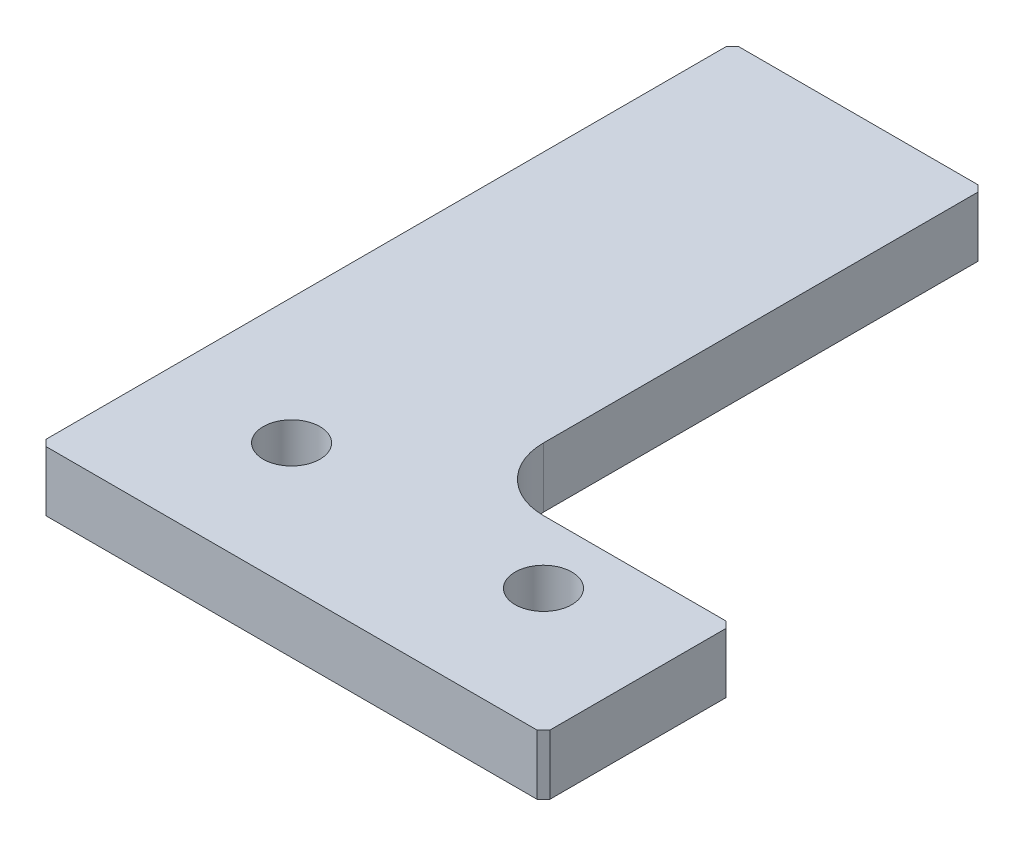
ISO-10303-21;
HEADER;
FILE_DESCRIPTION(('STEP AP214'),'2;1');
FILE_NAME('part.step','',(''),(''),'','','');
FILE_SCHEMA(('AUTOMOTIVE_DESIGN { 1 0 10303 214 1 1 1 1 }'));
ENDSEC;
DATA;
#1=APPLICATION_CONTEXT('core data for automotive mechanical design processes');
#2=APPLICATION_PROTOCOL_DEFINITION('international standard','automotive_design',2000,#1);
#3=PRODUCT_CONTEXT('',#1,'mechanical');
#4=PRODUCT('Part','Part','',(#3));
#5=PRODUCT_RELATED_PRODUCT_CATEGORY('part','',(#4));
#6=PRODUCT_DEFINITION_FORMATION('','',#4);
#7=PRODUCT_DEFINITION_CONTEXT('part definition',#1,'design');
#8=PRODUCT_DEFINITION('design','',#6,#7);
#9=PRODUCT_DEFINITION_SHAPE('','',#8);
#10=(LENGTH_UNIT() NAMED_UNIT(*) SI_UNIT(.MILLI.,.METRE.));
#11=(NAMED_UNIT(*) PLANE_ANGLE_UNIT() SI_UNIT($,.RADIAN.));
#12=(NAMED_UNIT(*) SI_UNIT($,.STERADIAN.) SOLID_ANGLE_UNIT());
#13=UNCERTAINTY_MEASURE_WITH_UNIT(LENGTH_MEASURE(1.E-05),#10,'distance_accuracy_value','');
#14=(GEOMETRIC_REPRESENTATION_CONTEXT(3) GLOBAL_UNCERTAINTY_ASSIGNED_CONTEXT((#13)) GLOBAL_UNIT_ASSIGNED_CONTEXT((#10,
#11,#12)) REPRESENTATION_CONTEXT('',''));
#15=CARTESIAN_POINT('',(0.,0.,0.));
#16=DIRECTION('',(0.,0.,1.));
#17=DIRECTION('',(1.,0.,0.));
#18=AXIS2_PLACEMENT_3D('',#15,#16,#17);
#19=CARTESIAN_POINT('',(20.,9.525,-90.));
#20=DIRECTION('',(0.,0.,1.));
#21=DIRECTION('',(1.,0.,0.));
#22=AXIS2_PLACEMENT_3D('',#19,#20,#21);
#23=PLANE('',#22);
#24=DIRECTION('',(-1.,0.,0.));
#25=VECTOR('',#24,1.);
#26=CARTESIAN_POINT('',(20.,9.525,-90.));
#27=LINE('',#26,#25);
#28=CARTESIAN_POINT('',(19.,9.525,-90.));
#29=VERTEX_POINT('',#28);
#30=CARTESIAN_POINT('',(-19.,9.525,-90.));
#31=VERTEX_POINT('',#30);
#32=EDGE_CURVE('E157',#29,#31,#27,.T.);
#33=ORIENTED_EDGE('',*,*,#32,.F.);
#34=DIRECTION('',(0.,-1.,0.));
#35=VECTOR('',#34,1.);
#36=CARTESIAN_POINT('',(19.,9.525,-90.));
#37=LINE('',#36,#35);
#38=CARTESIAN_POINT('',(19.,0.,-90.));
#39=VERTEX_POINT('',#38);
#40=EDGE_CURVE('E51',#29,#39,#37,.T.);
#41=ORIENTED_EDGE('',*,*,#40,.T.);
#42=DIRECTION('',(-1.,0.,0.));
#43=VECTOR('',#42,1.);
#44=CARTESIAN_POINT('',(20.,0.,-90.));
#45=LINE('',#44,#43);
#46=CARTESIAN_POINT('',(-19.,0.,-90.));
#47=VERTEX_POINT('',#46);
#48=EDGE_CURVE('E234',#39,#47,#45,.T.);
#49=ORIENTED_EDGE('',*,*,#48,.T.);
#50=DIRECTION('',(0.,1.,0.));
#51=VECTOR('',#50,1.);
#52=CARTESIAN_POINT('',(-19.,9.525,-90.));
#53=LINE('',#52,#51);
#54=EDGE_CURVE('E226',#47,#31,#53,.T.);
#55=ORIENTED_EDGE('',*,*,#54,.T.);
#56=EDGE_LOOP('',(#33,#41,#49,#55));
#57=FACE_BOUND('',#56,.T.);
#58=ADVANCED_FACE('F41',(#57),#23,.F.);
#59=CARTESIAN_POINT('',(-20.,9.525,-90.));
#60=DIRECTION('',(1.,0.,0.));
#61=DIRECTION('',(0.,0.,-1.));
#62=AXIS2_PLACEMENT_3D('',#59,#60,#61);
#63=PLANE('',#62);
#64=DIRECTION('',(0.,0.,1.));
#65=VECTOR('',#64,1.);
#66=CARTESIAN_POINT('',(-20.,0.,-90.));
#67=LINE('',#66,#65);
#68=CARTESIAN_POINT('',(-20.,0.,-89.));
#69=VERTEX_POINT('',#68);
#70=CARTESIAN_POINT('',(-20.,0.,19.));
#71=VERTEX_POINT('',#70);
#72=EDGE_CURVE('E240',#69,#71,#67,.T.);
#73=ORIENTED_EDGE('',*,*,#72,.T.);
#74=DIRECTION('',(0.,1.,0.));
#75=VECTOR('',#74,1.);
#76=CARTESIAN_POINT('',(-20.,9.525,19.));
#77=LINE('',#76,#75);
#78=CARTESIAN_POINT('',(-20.,9.525,19.));
#79=VERTEX_POINT('',#78);
#80=EDGE_CURVE('E223',#71,#79,#77,.T.);
#81=ORIENTED_EDGE('',*,*,#80,.T.);
#82=DIRECTION('',(0.,0.,1.));
#83=VECTOR('',#82,1.);
#84=CARTESIAN_POINT('',(-20.,9.525,-90.));
#85=LINE('',#84,#83);
#86=CARTESIAN_POINT('',(-20.,9.525,-89.));
#87=VERTEX_POINT('',#86);
#88=EDGE_CURVE('E163',#87,#79,#85,.T.);
#89=ORIENTED_EDGE('',*,*,#88,.F.);
#90=DIRECTION('',(0.,-1.,0.));
#91=VECTOR('',#90,1.);
#92=CARTESIAN_POINT('',(-20.,9.525,-89.));
#93=LINE('',#92,#91);
#94=EDGE_CURVE('E219',#87,#69,#93,.T.);
#95=ORIENTED_EDGE('',*,*,#94,.T.);
#96=EDGE_LOOP('',(#73,#81,#89,#95));
#97=FACE_BOUND('',#96,.T.);
#98=ADVANCED_FACE('F319',(#97),#63,.F.);
#99=CARTESIAN_POINT('',(-20.,9.525,20.));
#100=DIRECTION('',(0.,0.,-1.));
#101=DIRECTION('',(-1.,0.,0.));
#102=AXIS2_PLACEMENT_3D('',#99,#100,#101);
#103=PLANE('',#102);
#104=DIRECTION('',(1.,0.,0.));
#105=VECTOR('',#104,1.);
#106=CARTESIAN_POINT('',(-20.,0.,20.));
#107=LINE('',#106,#105);
#108=CARTESIAN_POINT('',(-19.,0.,20.));
#109=VERTEX_POINT('',#108);
#110=CARTESIAN_POINT('',(59.,0.,20.));
#111=VERTEX_POINT('',#110);
#112=EDGE_CURVE('E246',#109,#111,#107,.T.);
#113=ORIENTED_EDGE('',*,*,#112,.T.);
#114=DIRECTION('',(0.,1.,0.));
#115=VECTOR('',#114,1.);
#116=CARTESIAN_POINT('',(59.,9.525,20.));
#117=LINE('',#116,#115);
#118=CARTESIAN_POINT('',(59.,9.525,20.));
#119=VERTEX_POINT('',#118);
#120=EDGE_CURVE('E64',#111,#119,#117,.T.);
#121=ORIENTED_EDGE('',*,*,#120,.T.);
#122=DIRECTION('',(1.,0.,0.));
#123=VECTOR('',#122,1.);
#124=CARTESIAN_POINT('',(-20.,9.525,20.));
#125=LINE('',#124,#123);
#126=CARTESIAN_POINT('',(-19.,9.525,20.));
#127=VERTEX_POINT('',#126);
#128=EDGE_CURVE('E278',#127,#119,#125,.T.);
#129=ORIENTED_EDGE('',*,*,#128,.F.);
#130=DIRECTION('',(0.,-1.,0.));
#131=VECTOR('',#130,1.);
#132=CARTESIAN_POINT('',(-19.,9.525,20.));
#133=LINE('',#132,#131);
#134=EDGE_CURVE('E213',#127,#109,#133,.T.);
#135=ORIENTED_EDGE('',*,*,#134,.T.);
#136=EDGE_LOOP('',(#113,#121,#129,#135));
#137=FACE_BOUND('',#136,.T.);
#138=ADVANCED_FACE('F324',(#137),#103,.F.);
#139=CARTESIAN_POINT('',(60.,9.525,20.));
#140=DIRECTION('',(-1.,0.,0.));
#141=DIRECTION('',(0.,0.,1.));
#142=AXIS2_PLACEMENT_3D('',#139,#140,#141);
#143=PLANE('',#142);
#144=DIRECTION('',(0.,0.,-1.));
#145=VECTOR('',#144,1.);
#146=CARTESIAN_POINT('',(60.,0.,20.));
#147=LINE('',#146,#145);
#148=CARTESIAN_POINT('',(60.,0.,19.));
#149=VERTEX_POINT('',#148);
#150=CARTESIAN_POINT('',(60.,0.,-9.00000000000001));
#151=VERTEX_POINT('',#150);
#152=EDGE_CURVE('E165',#149,#151,#147,.T.);
#153=ORIENTED_EDGE('',*,*,#152,.T.);
#154=DIRECTION('',(0.,1.,0.));
#155=VECTOR('',#154,1.);
#156=CARTESIAN_POINT('',(60.,9.525,-9.00000000000001));
#157=LINE('',#156,#155);
#158=CARTESIAN_POINT('',(60.,9.525,-9.00000000000001));
#159=VERTEX_POINT('',#158);
#160=EDGE_CURVE('E195',#151,#159,#157,.T.);
#161=ORIENTED_EDGE('',*,*,#160,.T.);
#162=DIRECTION('',(0.,0.,-1.));
#163=VECTOR('',#162,1.);
#164=CARTESIAN_POINT('',(60.,9.525,20.));
#165=LINE('',#164,#163);
#166=CARTESIAN_POINT('',(60.,9.525,19.));
#167=VERTEX_POINT('',#166);
#168=EDGE_CURVE('E272',#167,#159,#165,.T.);
#169=ORIENTED_EDGE('',*,*,#168,.F.);
#170=DIRECTION('',(0.,-1.,0.));
#171=VECTOR('',#170,1.);
#172=CARTESIAN_POINT('',(60.,9.525,19.));
#173=LINE('',#172,#171);
#174=EDGE_CURVE('E191',#167,#149,#173,.T.);
#175=ORIENTED_EDGE('',*,*,#174,.T.);
#176=EDGE_LOOP('',(#153,#161,#169,#175));
#177=FACE_BOUND('',#176,.T.);
#178=ADVANCED_FACE('F260',(#177),#143,.F.);
#179=CARTESIAN_POINT('',(60.,9.525,-10.));
#180=DIRECTION('',(0.,0.,1.));
#181=DIRECTION('',(1.,0.,0.));
#182=AXIS2_PLACEMENT_3D('',#179,#180,#181);
#183=PLANE('',#182);
#184=DIRECTION('',(-1.,0.,0.));
#185=VECTOR('',#184,1.);
#186=CARTESIAN_POINT('',(60.,9.525,-10.));
#187=LINE('',#186,#185);
#188=CARTESIAN_POINT('',(59.,9.525,-10.));
#189=VERTEX_POINT('',#188);
#190=CARTESIAN_POINT('',(30.,9.525,-10.));
#191=VERTEX_POINT('',#190);
#192=EDGE_CURVE('E271',#189,#191,#187,.T.);
#193=ORIENTED_EDGE('',*,*,#192,.F.);
#194=DIRECTION('',(0.,-1.,0.));
#195=VECTOR('',#194,1.);
#196=CARTESIAN_POINT('',(59.,9.525,-10.));
#197=LINE('',#196,#195);
#198=CARTESIAN_POINT('',(59.,0.,-10.));
#199=VERTEX_POINT('',#198);
#200=EDGE_CURVE('E173',#189,#199,#197,.T.);
#201=ORIENTED_EDGE('',*,*,#200,.T.);
#202=DIRECTION('',(-1.,0.,0.));
#203=VECTOR('',#202,1.);
#204=CARTESIAN_POINT('',(60.,0.,-10.));
#205=LINE('',#204,#203);
#206=CARTESIAN_POINT('',(30.,0.,-10.));
#207=VERTEX_POINT('',#206);
#208=EDGE_CURVE('E158',#199,#207,#205,.T.);
#209=ORIENTED_EDGE('',*,*,#208,.T.);
#210=DIRECTION('',(0.,-1.,0.));
#211=VECTOR('',#210,1.);
#212=CARTESIAN_POINT('',(30.,9.525,-10.));
#213=LINE('',#212,#211);
#214=EDGE_CURVE('E141',#207,#191,#213,.F.);
#215=ORIENTED_EDGE('',*,*,#214,.T.);
#216=EDGE_LOOP('',(#193,#201,#209,#215));
#217=FACE_BOUND('',#216,.T.);
#218=ADVANCED_FACE('F274',(#217),#183,.F.);
#219=CARTESIAN_POINT('',(20.,9.525,-9.99999999999999));
#220=DIRECTION('',(-1.,0.,0.));
#221=DIRECTION('',(0.,0.,1.));
#222=AXIS2_PLACEMENT_3D('',#219,#220,#221);
#223=PLANE('',#222);
#224=DIRECTION('',(0.,0.,-1.));
#225=VECTOR('',#224,1.);
#226=CARTESIAN_POINT('',(20.,0.,-9.99999999999999));
#227=LINE('',#226,#225);
#228=CARTESIAN_POINT('',(20.,0.,-20.));
#229=VERTEX_POINT('',#228);
#230=CARTESIAN_POINT('',(20.,0.,-89.));
#231=VERTEX_POINT('',#230);
#232=EDGE_CURVE('E149',#229,#231,#227,.T.);
#233=ORIENTED_EDGE('',*,*,#232,.T.);
#234=DIRECTION('',(0.,1.,0.));
#235=VECTOR('',#234,1.);
#236=CARTESIAN_POINT('',(20.,9.525,-89.));
#237=LINE('',#236,#235);
#238=CARTESIAN_POINT('',(20.,9.525,-89.));
#239=VERTEX_POINT('',#238);
#240=EDGE_CURVE('E11',#231,#239,#237,.T.);
#241=ORIENTED_EDGE('',*,*,#240,.T.);
#242=DIRECTION('',(0.,0.,-1.));
#243=VECTOR('',#242,1.);
#244=CARTESIAN_POINT('',(20.,9.525,-9.99999999999999));
#245=LINE('',#244,#243);
#246=CARTESIAN_POINT('',(20.,9.525,-20.));
#247=VERTEX_POINT('',#246);
#248=EDGE_CURVE('E150',#247,#239,#245,.T.);
#249=ORIENTED_EDGE('',*,*,#248,.F.);
#250=DIRECTION('',(0.,-1.,0.));
#251=VECTOR('',#250,1.);
#252=CARTESIAN_POINT('',(20.,0.,-20.));
#253=LINE('',#252,#251);
#254=EDGE_CURVE('E139',#247,#229,#253,.T.);
#255=ORIENTED_EDGE('',*,*,#254,.T.);
#256=EDGE_LOOP('',(#233,#241,#249,#255));
#257=FACE_BOUND('',#256,.T.);
#258=ADVANCED_FACE('F148',(#257),#223,.F.);
#259=CARTESIAN_POINT('',(0.,9.525,0.));
#260=DIRECTION('',(0.,1.,0.));
#261=DIRECTION('',(0.,0.,1.));
#262=AXIS2_PLACEMENT_3D('',#259,#260,#261);
#263=PLANE('',#262);
#264=CARTESIAN_POINT('',(0.,9.525,0.));
#265=DIRECTION('',(0.,1.,0.));
#266=DIRECTION('',(0.,0.,1.));
#267=AXIS2_PLACEMENT_3D('',#264,#265,#266);
#268=CIRCLE('',#267,4.5);
#269=CARTESIAN_POINT('',(0.,9.525,4.5));
#270=VERTEX_POINT('',#269);
#271=EDGE_CURVE('E293',#270,#270,#268,.T.);
#272=ORIENTED_EDGE('',*,*,#271,.F.);
#273=EDGE_LOOP('',(#272));
#274=FACE_BOUND('',#273,.T.);
#275=CARTESIAN_POINT('',(40.,9.525,0.));
#276=DIRECTION('',(0.,1.,0.));
#277=DIRECTION('',(0.,0.,1.));
#278=AXIS2_PLACEMENT_3D('',#275,#276,#277);
#279=CIRCLE('',#278,4.5);
#280=CARTESIAN_POINT('',(40.,9.525,4.5));
#281=VERTEX_POINT('',#280);
#282=EDGE_CURVE('E249',#281,#281,#279,.T.);
#283=ORIENTED_EDGE('',*,*,#282,.F.);
#284=EDGE_LOOP('',(#283));
#285=FACE_BOUND('',#284,.T.);
#286=ORIENTED_EDGE('',*,*,#168,.T.);
#287=DIRECTION('',(0.707106781186547,0.,0.707106781186548));
#288=VECTOR('',#287,1.);
#289=CARTESIAN_POINT('',(34.5000000000001,9.525,-34.5));
#290=LINE('',#289,#288);
#291=EDGE_CURVE('E210',#159,#189,#290,.F.);
#292=ORIENTED_EDGE('',*,*,#291,.T.);
#293=ORIENTED_EDGE('',*,*,#192,.T.);
#294=CARTESIAN_POINT('',(30.,9.525,-20.));
#295=DIRECTION('',(0.,1.,0.));
#296=DIRECTION('',(0.,0.,1.));
#297=AXIS2_PLACEMENT_3D('',#294,#295,#296);
#298=CIRCLE('',#297,10.);
#299=EDGE_CURVE('E146',#191,#247,#298,.F.);
#300=ORIENTED_EDGE('',*,*,#299,.T.);
#301=ORIENTED_EDGE('',*,*,#248,.T.);
#302=DIRECTION('',(0.707106781186543,0.,0.707106781186552));
#303=VECTOR('',#302,1.);
#304=CARTESIAN_POINT('',(54.5000000000001,9.525,-54.4999999999994));
#305=LINE('',#304,#303);
#306=EDGE_CURVE('E201',#239,#29,#305,.F.);
#307=ORIENTED_EDGE('',*,*,#306,.T.);
#308=ORIENTED_EDGE('',*,*,#32,.T.);
#309=DIRECTION('',(0.70710678118655,0.,-0.707106781186545));
#310=VECTOR('',#309,1.);
#311=CARTESIAN_POINT('',(-54.4999999999999,9.525,-54.5000000000003));
#312=LINE('',#311,#310);
#313=EDGE_CURVE('E198',#31,#87,#312,.F.);
#314=ORIENTED_EDGE('',*,*,#313,.T.);
#315=ORIENTED_EDGE('',*,*,#88,.T.);
#316=DIRECTION('',(-0.707106781186549,0.,-0.707106781186546));
#317=VECTOR('',#316,1.);
#318=CARTESIAN_POINT('',(-19.5,9.525,19.5));
#319=LINE('',#318,#317);
#320=EDGE_CURVE('E204',#79,#127,#319,.F.);
#321=ORIENTED_EDGE('',*,*,#320,.T.);
#322=ORIENTED_EDGE('',*,*,#128,.T.);
#323=DIRECTION('',(-0.707106781186557,0.,0.707106781186538));
#324=VECTOR('',#323,1.);
#325=CARTESIAN_POINT('',(39.4999999999992,9.525,39.5000000000003));
#326=LINE('',#325,#324);
#327=EDGE_CURVE('E207',#119,#167,#326,.F.);
#328=ORIENTED_EDGE('',*,*,#327,.T.);
#329=EDGE_LOOP('',(#286,#292,#293,#300,#301,#307,#308,#314,#315,#321,#322,#328));
#330=FACE_BOUND('',#329,.T.);
#331=ADVANCED_FACE('F270',(#274,#285,#330),#263,.T.);
#332=CARTESIAN_POINT('',(0.,0.,0.));
#333=DIRECTION('',(0.,1.,0.));
#334=DIRECTION('',(0.,0.,1.));
#335=AXIS2_PLACEMENT_3D('',#332,#333,#334);
#336=PLANE('',#335);
#337=CARTESIAN_POINT('',(0.,0.,0.));
#338=DIRECTION('',(0.,1.,0.));
#339=DIRECTION('',(0.,0.,1.));
#340=AXIS2_PLACEMENT_3D('',#337,#338,#339);
#341=CIRCLE('',#340,4.5);
#342=CARTESIAN_POINT('',(0.,0.,4.5));
#343=VERTEX_POINT('',#342);
#344=EDGE_CURVE('E289',#343,#343,#341,.T.);
#345=ORIENTED_EDGE('',*,*,#344,.T.);
#346=EDGE_LOOP('',(#345));
#347=FACE_BOUND('',#346,.T.);
#348=CARTESIAN_POINT('',(40.,0.,0.));
#349=DIRECTION('',(0.,1.,0.));
#350=DIRECTION('',(0.,0.,1.));
#351=AXIS2_PLACEMENT_3D('',#348,#349,#350);
#352=CIRCLE('',#351,4.5);
#353=CARTESIAN_POINT('',(40.,0.,4.5));
#354=VERTEX_POINT('',#353);
#355=EDGE_CURVE('E241',#354,#354,#352,.T.);
#356=ORIENTED_EDGE('',*,*,#355,.T.);
#357=EDGE_LOOP('',(#356));
#358=FACE_BOUND('',#357,.T.);
#359=ORIENTED_EDGE('',*,*,#208,.F.);
#360=DIRECTION('',(-0.707106781186547,0.,-0.707106781186548));
#361=VECTOR('',#360,1.);
#362=CARTESIAN_POINT('',(59.,0.,-10.));
#363=LINE('',#362,#361);
#364=EDGE_CURVE('E188',#199,#151,#363,.F.);
#365=ORIENTED_EDGE('',*,*,#364,.T.);
#366=ORIENTED_EDGE('',*,*,#152,.F.);
#367=DIRECTION('',(0.707106781186557,0.,-0.707106781186538));
#368=VECTOR('',#367,1.);
#369=CARTESIAN_POINT('',(60.,0.,19.));
#370=LINE('',#369,#368);
#371=EDGE_CURVE('E185',#149,#111,#370,.F.);
#372=ORIENTED_EDGE('',*,*,#371,.T.);
#373=ORIENTED_EDGE('',*,*,#112,.F.);
#374=DIRECTION('',(0.707106781186549,0.,0.707106781186546));
#375=VECTOR('',#374,1.);
#376=CARTESIAN_POINT('',(-19.,0.,20.));
#377=LINE('',#376,#375);
#378=EDGE_CURVE('E182',#109,#71,#377,.F.);
#379=ORIENTED_EDGE('',*,*,#378,.T.);
#380=ORIENTED_EDGE('',*,*,#72,.F.);
#381=DIRECTION('',(-0.70710678118655,0.,0.707106781186545));
#382=VECTOR('',#381,1.);
#383=CARTESIAN_POINT('',(-20.,0.,-89.));
#384=LINE('',#383,#382);
#385=EDGE_CURVE('E177',#69,#47,#384,.F.);
#386=ORIENTED_EDGE('',*,*,#385,.T.);
#387=ORIENTED_EDGE('',*,*,#48,.F.);
#388=DIRECTION('',(-0.707106781186543,0.,-0.707106781186552));
#389=VECTOR('',#388,1.);
#390=CARTESIAN_POINT('',(19.,0.,-90.));
#391=LINE('',#390,#389);
#392=EDGE_CURVE('E155',#39,#231,#391,.F.);
#393=ORIENTED_EDGE('',*,*,#392,.T.);
#394=ORIENTED_EDGE('',*,*,#232,.F.);
#395=CARTESIAN_POINT('',(30.,0.,-20.));
#396=DIRECTION('',(0.,1.,0.));
#397=DIRECTION('',(0.,0.,1.));
#398=AXIS2_PLACEMENT_3D('',#395,#396,#397);
#399=CIRCLE('',#398,10.);
#400=EDGE_CURVE('E135',#229,#207,#399,.T.);
#401=ORIENTED_EDGE('',*,*,#400,.T.);
#402=EDGE_LOOP('',(#359,#365,#366,#372,#373,#379,#380,#386,#387,#393,#394,#401));
#403=FACE_BOUND('',#402,.T.);
#404=ADVANCED_FACE('F153',(#347,#358,#403),#336,.F.);
#405=CARTESIAN_POINT('',(40.,9.525,0.));
#406=DIRECTION('',(0.,1.,0.));
#407=DIRECTION('',(0.,0.,1.));
#408=AXIS2_PLACEMENT_3D('',#405,#406,#407);
#409=CYLINDRICAL_SURFACE('',#408,4.5);
#410=ORIENTED_EDGE('',*,*,#355,.F.);
#411=EDGE_LOOP('',(#410));
#412=FACE_BOUND('',#411,.T.);
#413=ORIENTED_EDGE('',*,*,#282,.T.);
#414=EDGE_LOOP('',(#413));
#415=FACE_BOUND('',#414,.T.);
#416=ADVANCED_FACE('F305',(#412,#415),#409,.F.);
#417=CARTESIAN_POINT('',(0.,9.525,0.));
#418=DIRECTION('',(0.,1.,0.));
#419=DIRECTION('',(0.,0.,1.));
#420=AXIS2_PLACEMENT_3D('',#417,#418,#419);
#421=CYLINDRICAL_SURFACE('',#420,4.5);
#422=ORIENTED_EDGE('',*,*,#344,.F.);
#423=EDGE_LOOP('',(#422));
#424=FACE_BOUND('',#423,.T.);
#425=ORIENTED_EDGE('',*,*,#271,.T.);
#426=EDGE_LOOP('',(#425));
#427=FACE_BOUND('',#426,.T.);
#428=ADVANCED_FACE('F298',(#424,#427),#421,.F.);
#429=CARTESIAN_POINT('',(30.,9.525,-20.));
#430=DIRECTION('',(0.,1.,0.));
#431=DIRECTION('',(0.,0.,1.));
#432=AXIS2_PLACEMENT_3D('',#429,#430,#431);
#433=CYLINDRICAL_SURFACE('',#432,10.);
#434=ORIENTED_EDGE('',*,*,#299,.F.);
#435=ORIENTED_EDGE('',*,*,#214,.F.);
#436=ORIENTED_EDGE('',*,*,#400,.F.);
#437=ORIENTED_EDGE('',*,*,#254,.F.);
#438=EDGE_LOOP('',(#434,#435,#436,#437));
#439=FACE_BOUND('',#438,.T.);
#440=ADVANCED_FACE('F138',(#439),#433,.F.);
#441=CARTESIAN_POINT('',(59.,9.525,-10.));
#442=DIRECTION('',(-0.707106781186548,0.,0.707106781186547));
#443=DIRECTION('',(0.,-1.,0.));
#444=AXIS2_PLACEMENT_3D('',#441,#442,#443);
#445=PLANE('',#444);
#446=ORIENTED_EDGE('',*,*,#291,.F.);
#447=ORIENTED_EDGE('',*,*,#160,.F.);
#448=ORIENTED_EDGE('',*,*,#364,.F.);
#449=ORIENTED_EDGE('',*,*,#200,.F.);
#450=EDGE_LOOP('',(#446,#447,#448,#449));
#451=FACE_BOUND('',#450,.T.);
#452=ADVANCED_FACE('F266',(#451),#445,.F.);
#453=CARTESIAN_POINT('',(60.,9.525,19.));
#454=DIRECTION('',(-0.707106781186538,0.,-0.707106781186557));
#455=DIRECTION('',(0.,-1.,0.));
#456=AXIS2_PLACEMENT_3D('',#453,#454,#455);
#457=PLANE('',#456);
#458=ORIENTED_EDGE('',*,*,#327,.F.);
#459=ORIENTED_EDGE('',*,*,#120,.F.);
#460=ORIENTED_EDGE('',*,*,#371,.F.);
#461=ORIENTED_EDGE('',*,*,#174,.F.);
#462=EDGE_LOOP('',(#458,#459,#460,#461));
#463=FACE_BOUND('',#462,.T.);
#464=ADVANCED_FACE('F337',(#463),#457,.F.);
#465=CARTESIAN_POINT('',(-19.,9.525,20.));
#466=DIRECTION('',(0.707106781186546,0.,-0.707106781186549));
#467=DIRECTION('',(0.,-1.,0.));
#468=AXIS2_PLACEMENT_3D('',#465,#466,#467);
#469=PLANE('',#468);
#470=ORIENTED_EDGE('',*,*,#320,.F.);
#471=ORIENTED_EDGE('',*,*,#80,.F.);
#472=ORIENTED_EDGE('',*,*,#378,.F.);
#473=ORIENTED_EDGE('',*,*,#134,.F.);
#474=EDGE_LOOP('',(#470,#471,#472,#473));
#475=FACE_BOUND('',#474,.T.);
#476=ADVANCED_FACE('F343',(#475),#469,.F.);
#477=CARTESIAN_POINT('',(19.,9.525,-90.));
#478=DIRECTION('',(-0.707106781186552,0.,0.707106781186542));
#479=DIRECTION('',(0.,-1.,0.));
#480=AXIS2_PLACEMENT_3D('',#477,#478,#479);
#481=PLANE('',#480);
#482=ORIENTED_EDGE('',*,*,#306,.F.);
#483=ORIENTED_EDGE('',*,*,#240,.F.);
#484=ORIENTED_EDGE('',*,*,#392,.F.);
#485=ORIENTED_EDGE('',*,*,#40,.F.);
#486=EDGE_LOOP('',(#482,#483,#484,#485));
#487=FACE_BOUND('',#486,.T.);
#488=ADVANCED_FACE('F349',(#487),#481,.F.);
#489=CARTESIAN_POINT('',(-20.,9.525,-89.));
#490=DIRECTION('',(0.707106781186545,0.,0.70710678118655));
#491=DIRECTION('',(0.,-1.,0.));
#492=AXIS2_PLACEMENT_3D('',#489,#490,#491);
#493=PLANE('',#492);
#494=ORIENTED_EDGE('',*,*,#313,.F.);
#495=ORIENTED_EDGE('',*,*,#54,.F.);
#496=ORIENTED_EDGE('',*,*,#385,.F.);
#497=ORIENTED_EDGE('',*,*,#94,.F.);
#498=EDGE_LOOP('',(#494,#495,#496,#497));
#499=FACE_BOUND('',#498,.T.);
#500=ADVANCED_FACE('F44',(#499),#493,.F.);
#501=CLOSED_SHELL('',(#58,#98,#138,#178,#218,#258,#331,#404,#416,#428,#440,#452,#464,#476,#488,#500));
#502=MANIFOLD_SOLID_BREP('B2',#501);
#503=ADVANCED_BREP_SHAPE_REPRESENTATION('',(#18,#502),#14);
#504=SHAPE_DEFINITION_REPRESENTATION(#9,#503);
ENDSEC;
END-ISO-10303-21;
